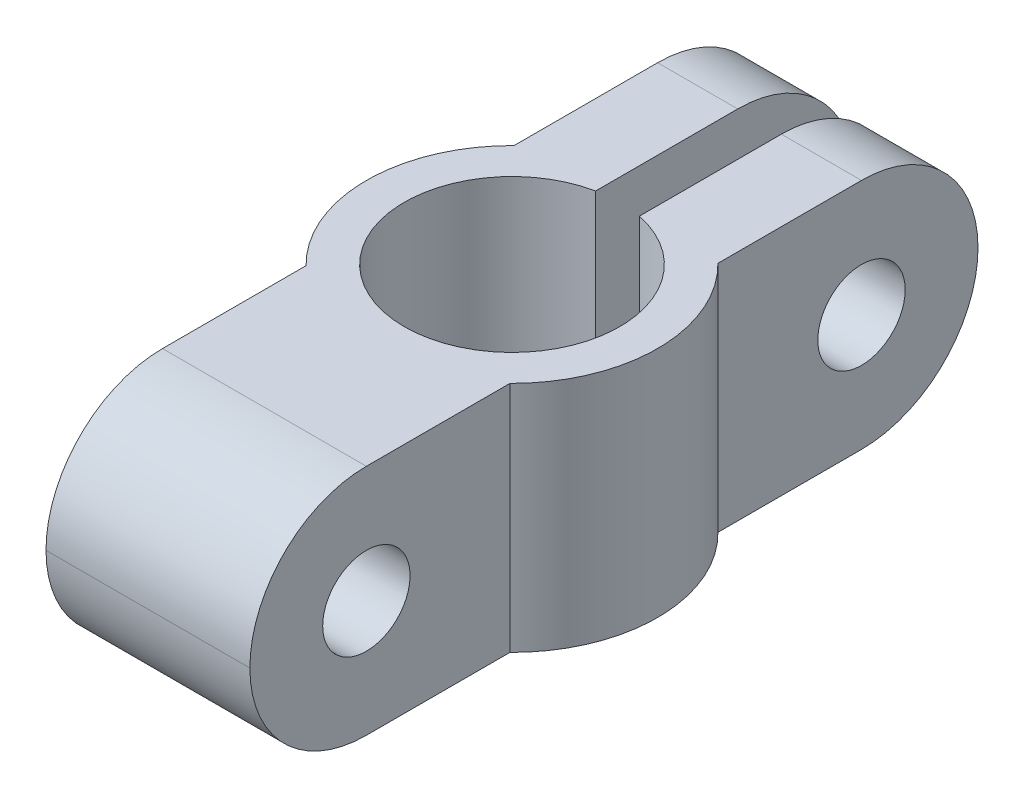
ISO-10303-21;
HEADER;
FILE_DESCRIPTION(('STEP AP214'),'2;1');
FILE_NAME('part.step','',(''),(''),'','','');
FILE_SCHEMA(('AUTOMOTIVE_DESIGN { 1 0 10303 214 1 1 1 1 }'));
ENDSEC;
DATA;
#1=APPLICATION_CONTEXT('core data for automotive mechanical design processes');
#2=APPLICATION_PROTOCOL_DEFINITION('international standard','automotive_design',2000,#1);
#3=PRODUCT_CONTEXT('',#1,'mechanical');
#4=PRODUCT('Part','Part','',(#3));
#5=PRODUCT_RELATED_PRODUCT_CATEGORY('part','',(#4));
#6=PRODUCT_DEFINITION_FORMATION('','',#4);
#7=PRODUCT_DEFINITION_CONTEXT('part definition',#1,'design');
#8=PRODUCT_DEFINITION('design','',#6,#7);
#9=PRODUCT_DEFINITION_SHAPE('','',#8);
#10=(LENGTH_UNIT() NAMED_UNIT(*) SI_UNIT(.MILLI.,.METRE.));
#11=(NAMED_UNIT(*) PLANE_ANGLE_UNIT() SI_UNIT($,.RADIAN.));
#12=(NAMED_UNIT(*) SI_UNIT($,.STERADIAN.) SOLID_ANGLE_UNIT());
#13=UNCERTAINTY_MEASURE_WITH_UNIT(LENGTH_MEASURE(1.E-05),#10,'distance_accuracy_value','');
#14=(GEOMETRIC_REPRESENTATION_CONTEXT(3) GLOBAL_UNCERTAINTY_ASSIGNED_CONTEXT((#13)) GLOBAL_UNIT_ASSIGNED_CONTEXT((#10,
#11,#12)) REPRESENTATION_CONTEXT('',''));
#15=CARTESIAN_POINT('',(0.,0.,0.));
#16=DIRECTION('',(0.,0.,1.));
#17=DIRECTION('',(1.,0.,0.));
#18=AXIS2_PLACEMENT_3D('',#15,#16,#17);
#19=CARTESIAN_POINT('',(0.,4.,-8.5));
#20=DIRECTION('',(1.,0.,0.));
#21=DIRECTION('',(0.,0.,-1.));
#22=AXIS2_PLACEMENT_3D('',#19,#20,#21);
#23=CYLINDRICAL_SURFACE('',#22,4.);
#24=CARTESIAN_POINT('',(0.75,4.,-8.5));
#25=DIRECTION('',(1.,0.,0.));
#26=DIRECTION('',(0.,0.,-1.));
#27=AXIS2_PLACEMENT_3D('',#24,#25,#26);
#28=CIRCLE('',#27,4.);
#29=CARTESIAN_POINT('',(0.75,8.,-8.5));
#30=VERTEX_POINT('',#29);
#31=CARTESIAN_POINT('',(0.75,4.,-12.5));
#32=VERTEX_POINT('',#31);
#33=EDGE_CURVE('E221',#30,#32,#28,.F.);
#34=ORIENTED_EDGE('',*,*,#33,.F.);
#35=DIRECTION('',(-1.,0.,0.));
#36=VECTOR('',#35,1.);
#37=CARTESIAN_POINT('',(-3.5,8.,-8.5));
#38=LINE('',#37,#36);
#39=CARTESIAN_POINT('',(3.5,8.,-8.5));
#40=VERTEX_POINT('',#39);
#41=EDGE_CURVE('E163',#40,#30,#38,.T.);
#42=ORIENTED_EDGE('',*,*,#41,.F.);
#43=CARTESIAN_POINT('',(3.5,4.,-8.5));
#44=DIRECTION('',(-1.,0.,0.));
#45=DIRECTION('',(0.,0.,1.));
#46=AXIS2_PLACEMENT_3D('',#43,#44,#45);
#47=CIRCLE('',#46,4.);
#48=CARTESIAN_POINT('',(3.5,4.,-12.5));
#49=VERTEX_POINT('',#48);
#50=EDGE_CURVE('E169',#49,#40,#47,.F.);
#51=ORIENTED_EDGE('',*,*,#50,.F.);
#52=DIRECTION('',(-1.,0.,0.));
#53=VECTOR('',#52,1.);
#54=CARTESIAN_POINT('',(3.5,4.,-12.5));
#55=LINE('',#54,#53);
#56=EDGE_CURVE('E176',#32,#49,#55,.F.);
#57=ORIENTED_EDGE('',*,*,#56,.F.);
#58=EDGE_LOOP('',(#34,#42,#51,#57));
#59=FACE_BOUND('',#58,.T.);
#60=ADVANCED_FACE('F35',(#59),#23,.T.);
#61=CARTESIAN_POINT('',(-3.5,4.,-8.5));
#62=DIRECTION('',(-1.,0.,0.));
#63=DIRECTION('',(0.,0.,1.));
#64=AXIS2_PLACEMENT_3D('',#61,#62,#63);
#65=CYLINDRICAL_SURFACE('',#64,4.);
#66=CARTESIAN_POINT('',(0.75,4.,-8.5));
#67=DIRECTION('',(1.,0.,0.));
#68=DIRECTION('',(0.,0.,-1.));
#69=AXIS2_PLACEMENT_3D('',#66,#67,#68);
#70=CIRCLE('',#69,4.);
#71=CARTESIAN_POINT('',(0.75,0.,-8.5));
#72=VERTEX_POINT('',#71);
#73=EDGE_CURVE('E219',#32,#72,#70,.F.);
#74=ORIENTED_EDGE('',*,*,#73,.F.);
#75=ORIENTED_EDGE('',*,*,#56,.T.);
#76=CARTESIAN_POINT('',(3.5,4.,-8.5));
#77=DIRECTION('',(-1.,0.,0.));
#78=DIRECTION('',(0.,0.,1.));
#79=AXIS2_PLACEMENT_3D('',#76,#77,#78);
#80=CIRCLE('',#79,4.);
#81=CARTESIAN_POINT('',(3.5,0.,-8.5));
#82=VERTEX_POINT('',#81);
#83=EDGE_CURVE('E164',#82,#49,#80,.F.);
#84=ORIENTED_EDGE('',*,*,#83,.F.);
#85=DIRECTION('',(-1.,0.,0.));
#86=VECTOR('',#85,1.);
#87=CARTESIAN_POINT('',(0.,0.,-8.5));
#88=LINE('',#87,#86);
#89=EDGE_CURVE('E276',#72,#82,#88,.F.);
#90=ORIENTED_EDGE('',*,*,#89,.F.);
#91=EDGE_LOOP('',(#74,#75,#84,#90));
#92=FACE_BOUND('',#91,.T.);
#93=ADVANCED_FACE('F293',(#92),#65,.T.);
#94=CARTESIAN_POINT('',(-5.,4.,-8.5));
#95=DIRECTION('',(1.,0.,0.));
#96=DIRECTION('',(0.,0.,-1.));
#97=AXIS2_PLACEMENT_3D('',#94,#95,#96);
#98=CYLINDRICAL_SURFACE('',#97,1.5);
#99=CARTESIAN_POINT('',(0.75,4.,-8.5));
#100=DIRECTION('',(1.,0.,0.));
#101=DIRECTION('',(0.,0.,-1.));
#102=AXIS2_PLACEMENT_3D('',#99,#100,#101);
#103=CIRCLE('',#102,1.5);
#104=CARTESIAN_POINT('',(0.75,4.,-9.99999999999999));
#105=VERTEX_POINT('',#104);
#106=EDGE_CURVE('E223',#105,#105,#103,.F.);
#107=ORIENTED_EDGE('',*,*,#106,.T.);
#108=EDGE_LOOP('',(#107));
#109=FACE_BOUND('',#108,.T.);
#110=CARTESIAN_POINT('',(3.5,4.,-8.5));
#111=DIRECTION('',(1.,0.,0.));
#112=DIRECTION('',(0.,0.,-1.));
#113=AXIS2_PLACEMENT_3D('',#110,#111,#112);
#114=CIRCLE('',#113,1.5);
#115=CARTESIAN_POINT('',(3.5,4.,-10.));
#116=VERTEX_POINT('',#115);
#117=EDGE_CURVE('E180',#116,#116,#114,.T.);
#118=ORIENTED_EDGE('',*,*,#117,.T.);
#119=EDGE_LOOP('',(#118));
#120=FACE_BOUND('',#119,.T.);
#121=ADVANCED_FACE('F331',(#109,#120),#98,.F.);
#122=CARTESIAN_POINT('',(0.,8.,0.));
#123=DIRECTION('',(0.,-1.,0.));
#124=DIRECTION('',(0.,0.,-1.));
#125=AXIS2_PLACEMENT_3D('',#122,#123,#124);
#126=CYLINDRICAL_SURFACE('',#125,5.);
#127=CARTESIAN_POINT('',(0.,0.,0.));
#128=DIRECTION('',(0.,1.,0.));
#129=DIRECTION('',(0.,0.,1.));
#130=AXIS2_PLACEMENT_3D('',#127,#128,#129);
#131=CIRCLE('',#130,5.);
#132=CARTESIAN_POINT('',(-3.5,0.,-3.57071421427143));
#133=VERTEX_POINT('',#132);
#134=CARTESIAN_POINT('',(-3.5,0.,3.57071421427143));
#135=VERTEX_POINT('',#134);
#136=EDGE_CURVE('E175',#133,#135,#131,.T.);
#137=ORIENTED_EDGE('',*,*,#136,.T.);
#138=DIRECTION('',(0.,-1.,0.));
#139=VECTOR('',#138,1.);
#140=CARTESIAN_POINT('',(-3.5,8.,3.57071421427143));
#141=LINE('',#140,#139);
#142=CARTESIAN_POINT('',(-3.5,8.,3.57071421427143));
#143=VERTEX_POINT('',#142);
#144=EDGE_CURVE('E270',#143,#135,#141,.T.);
#145=ORIENTED_EDGE('',*,*,#144,.F.);
#146=CARTESIAN_POINT('',(0.,8.,0.));
#147=DIRECTION('',(0.,1.,0.));
#148=DIRECTION('',(0.,0.,1.));
#149=AXIS2_PLACEMENT_3D('',#146,#147,#148);
#150=CIRCLE('',#149,5.);
#151=CARTESIAN_POINT('',(-3.5,8.,-3.57071421427143));
#152=VERTEX_POINT('',#151);
#153=EDGE_CURVE('E232',#152,#143,#150,.T.);
#154=ORIENTED_EDGE('',*,*,#153,.F.);
#155=DIRECTION('',(0.,-1.,0.));
#156=VECTOR('',#155,1.);
#157=CARTESIAN_POINT('',(-3.5,8.,-3.57071421427143));
#158=LINE('',#157,#156);
#159=EDGE_CURVE('E248',#152,#133,#158,.T.);
#160=ORIENTED_EDGE('',*,*,#159,.T.);
#161=EDGE_LOOP('',(#137,#145,#154,#160));
#162=FACE_BOUND('',#161,.T.);
#163=ADVANCED_FACE('F314',(#162),#126,.T.);
#164=CARTESIAN_POINT('',(-3.5,8.,12.5));
#165=DIRECTION('',(1.,0.,0.));
#166=DIRECTION('',(0.,0.,-1.));
#167=AXIS2_PLACEMENT_3D('',#164,#165,#166);
#168=PLANE('',#167);
#169=CARTESIAN_POINT('',(-3.5,4.,8.5));
#170=DIRECTION('',(-1.,0.,0.));
#171=DIRECTION('',(0.,0.,1.));
#172=AXIS2_PLACEMENT_3D('',#169,#170,#171);
#173=CIRCLE('',#172,1.5);
#174=CARTESIAN_POINT('',(-3.5,4.,10.));
#175=VERTEX_POINT('',#174);
#176=EDGE_CURVE('E198',#175,#175,#173,.T.);
#177=ORIENTED_EDGE('',*,*,#176,.F.);
#178=EDGE_LOOP('',(#177));
#179=FACE_BOUND('',#178,.T.);
#180=CARTESIAN_POINT('',(-3.5,4.,8.5));
#181=DIRECTION('',(1.,0.,0.));
#182=DIRECTION('',(0.,0.,-1.));
#183=AXIS2_PLACEMENT_3D('',#180,#181,#182);
#184=CIRCLE('',#183,4.);
#185=CARTESIAN_POINT('',(-3.5,0.,8.5));
#186=VERTEX_POINT('',#185);
#187=CARTESIAN_POINT('',(-3.5,4.,12.5));
#188=VERTEX_POINT('',#187);
#189=EDGE_CURVE('E187',#186,#188,#184,.F.);
#190=ORIENTED_EDGE('',*,*,#189,.T.);
#191=CARTESIAN_POINT('',(-3.5,4.,8.5));
#192=DIRECTION('',(1.,0.,0.));
#193=DIRECTION('',(0.,0.,-1.));
#194=AXIS2_PLACEMENT_3D('',#191,#192,#193);
#195=CIRCLE('',#194,4.);
#196=CARTESIAN_POINT('',(-3.5,8.,8.5));
#197=VERTEX_POINT('',#196);
#198=EDGE_CURVE('E189',#188,#197,#195,.F.);
#199=ORIENTED_EDGE('',*,*,#198,.T.);
#200=DIRECTION('',(0.,0.,1.));
#201=VECTOR('',#200,1.);
#202=CARTESIAN_POINT('',(-3.5,8.,12.5));
#203=LINE('',#202,#201);
#204=EDGE_CURVE('E235',#143,#197,#203,.T.);
#205=ORIENTED_EDGE('',*,*,#204,.F.);
#206=ORIENTED_EDGE('',*,*,#144,.T.);
#207=DIRECTION('',(0.,0.,1.));
#208=VECTOR('',#207,1.);
#209=CARTESIAN_POINT('',(-3.5,0.,12.5));
#210=LINE('',#209,#208);
#211=EDGE_CURVE('E251',#135,#186,#210,.T.);
#212=ORIENTED_EDGE('',*,*,#211,.T.);
#213=EDGE_LOOP('',(#190,#199,#205,#206,#212));
#214=FACE_BOUND('',#213,.T.);
#215=ADVANCED_FACE('F310',(#179,#214),#168,.F.);
#216=CARTESIAN_POINT('',(3.5,8.,12.5));
#217=DIRECTION('',(-1.,0.,0.));
#218=DIRECTION('',(0.,0.,1.));
#219=AXIS2_PLACEMENT_3D('',#216,#217,#218);
#220=PLANE('',#219);
#221=CARTESIAN_POINT('',(3.5,4.,8.5));
#222=DIRECTION('',(-1.,0.,0.));
#223=DIRECTION('',(0.,0.,1.));
#224=AXIS2_PLACEMENT_3D('',#221,#222,#223);
#225=CIRCLE('',#224,1.5);
#226=CARTESIAN_POINT('',(3.5,4.,10.));
#227=VERTEX_POINT('',#226);
#228=EDGE_CURVE('E196',#227,#227,#225,.T.);
#229=ORIENTED_EDGE('',*,*,#228,.T.);
#230=EDGE_LOOP('',(#229));
#231=FACE_BOUND('',#230,.T.);
#232=DIRECTION('',(0.,0.,-1.));
#233=VECTOR('',#232,1.);
#234=CARTESIAN_POINT('',(3.5,8.,12.5));
#235=LINE('',#234,#233);
#236=CARTESIAN_POINT('',(3.5,8.,8.5));
#237=VERTEX_POINT('',#236);
#238=CARTESIAN_POINT('',(3.5,8.,3.57071421427142));
#239=VERTEX_POINT('',#238);
#240=EDGE_CURVE('E239',#237,#239,#235,.T.);
#241=ORIENTED_EDGE('',*,*,#240,.F.);
#242=CARTESIAN_POINT('',(3.5,4.,8.5));
#243=DIRECTION('',(-1.,0.,0.));
#244=DIRECTION('',(0.,0.,1.));
#245=AXIS2_PLACEMENT_3D('',#242,#243,#244);
#246=CIRCLE('',#245,4.);
#247=CARTESIAN_POINT('',(3.5,4.,12.5));
#248=VERTEX_POINT('',#247);
#249=EDGE_CURVE('E185',#237,#248,#246,.F.);
#250=ORIENTED_EDGE('',*,*,#249,.T.);
#251=CARTESIAN_POINT('',(3.5,4.,8.5));
#252=DIRECTION('',(-1.,0.,0.));
#253=DIRECTION('',(0.,0.,1.));
#254=AXIS2_PLACEMENT_3D('',#251,#252,#253);
#255=CIRCLE('',#254,4.);
#256=CARTESIAN_POINT('',(3.5,0.,8.5));
#257=VERTEX_POINT('',#256);
#258=EDGE_CURVE('E183',#248,#257,#255,.F.);
#259=ORIENTED_EDGE('',*,*,#258,.T.);
#260=DIRECTION('',(0.,0.,-1.));
#261=VECTOR('',#260,1.);
#262=CARTESIAN_POINT('',(3.5,0.,12.5));
#263=LINE('',#262,#261);
#264=CARTESIAN_POINT('',(3.5,0.,3.57071421427142));
#265=VERTEX_POINT('',#264);
#266=EDGE_CURVE('E254',#257,#265,#263,.T.);
#267=ORIENTED_EDGE('',*,*,#266,.T.);
#268=DIRECTION('',(0.,-1.,0.));
#269=VECTOR('',#268,1.);
#270=CARTESIAN_POINT('',(3.5,8.,3.57071421427142));
#271=LINE('',#270,#269);
#272=EDGE_CURVE('E267',#239,#265,#271,.T.);
#273=ORIENTED_EDGE('',*,*,#272,.F.);
#274=EDGE_LOOP('',(#241,#250,#259,#267,#273));
#275=FACE_BOUND('',#274,.T.);
#276=ADVANCED_FACE('F302',(#231,#275),#220,.F.);
#277=CARTESIAN_POINT('',(0.,8.,0.));
#278=DIRECTION('',(0.,-1.,0.));
#279=DIRECTION('',(0.,0.,-1.));
#280=AXIS2_PLACEMENT_3D('',#277,#278,#279);
#281=CYLINDRICAL_SURFACE('',#280,5.);
#282=CARTESIAN_POINT('',(0.,0.,0.));
#283=DIRECTION('',(0.,1.,0.));
#284=DIRECTION('',(0.,0.,1.));
#285=AXIS2_PLACEMENT_3D('',#282,#283,#284);
#286=CIRCLE('',#285,5.);
#287=CARTESIAN_POINT('',(3.5,0.,-3.57071421427142));
#288=VERTEX_POINT('',#287);
#289=EDGE_CURVE('E256',#265,#288,#286,.T.);
#290=ORIENTED_EDGE('',*,*,#289,.T.);
#291=DIRECTION('',(0.,-1.,0.));
#292=VECTOR('',#291,1.);
#293=CARTESIAN_POINT('',(3.5,8.,-3.57071421427142));
#294=LINE('',#293,#292);
#295=CARTESIAN_POINT('',(3.5,8.,-3.57071421427142));
#296=VERTEX_POINT('',#295);
#297=EDGE_CURVE('E264',#296,#288,#294,.T.);
#298=ORIENTED_EDGE('',*,*,#297,.F.);
#299=CARTESIAN_POINT('',(0.,8.,0.));
#300=DIRECTION('',(0.,1.,0.));
#301=DIRECTION('',(0.,0.,1.));
#302=AXIS2_PLACEMENT_3D('',#299,#300,#301);
#303=CIRCLE('',#302,5.);
#304=EDGE_CURVE('E241',#239,#296,#303,.T.);
#305=ORIENTED_EDGE('',*,*,#304,.F.);
#306=ORIENTED_EDGE('',*,*,#272,.T.);
#307=EDGE_LOOP('',(#290,#298,#305,#306));
#308=FACE_BOUND('',#307,.T.);
#309=ADVANCED_FACE('F298',(#308),#281,.T.);
#310=CARTESIAN_POINT('',(3.5,8.,-3.57071421427142));
#311=DIRECTION('',(-1.,0.,0.));
#312=DIRECTION('',(0.,0.,1.));
#313=AXIS2_PLACEMENT_3D('',#310,#311,#312);
#314=PLANE('',#313);
#315=ORIENTED_EDGE('',*,*,#117,.F.);
#316=EDGE_LOOP('',(#315));
#317=FACE_BOUND('',#316,.T.);
#318=DIRECTION('',(0.,0.,-1.));
#319=VECTOR('',#318,1.);
#320=CARTESIAN_POINT('',(3.5,0.,-3.57071421427142));
#321=LINE('',#320,#319);
#322=EDGE_CURVE('E258',#288,#82,#321,.T.);
#323=ORIENTED_EDGE('',*,*,#322,.T.);
#324=ORIENTED_EDGE('',*,*,#83,.T.);
#325=ORIENTED_EDGE('',*,*,#50,.T.);
#326=DIRECTION('',(0.,0.,-1.));
#327=VECTOR('',#326,1.);
#328=CARTESIAN_POINT('',(3.5,8.,-3.57071421427142));
#329=LINE('',#328,#327);
#330=EDGE_CURVE('E243',#296,#40,#329,.T.);
#331=ORIENTED_EDGE('',*,*,#330,.F.);
#332=ORIENTED_EDGE('',*,*,#297,.T.);
#333=EDGE_LOOP('',(#323,#324,#325,#331,#332));
#334=FACE_BOUND('',#333,.T.);
#335=ADVANCED_FACE('F280',(#317,#334),#314,.F.);
#336=CARTESIAN_POINT('',(-3.5,8.,-3.57071421427143));
#337=DIRECTION('',(1.,0.,0.));
#338=DIRECTION('',(0.,0.,-1.));
#339=AXIS2_PLACEMENT_3D('',#336,#337,#338);
#340=PLANE('',#339);
#341=CARTESIAN_POINT('',(-3.5,4.,-8.5));
#342=DIRECTION('',(1.,0.,0.));
#343=DIRECTION('',(0.,0.,-1.));
#344=AXIS2_PLACEMENT_3D('',#341,#342,#343);
#345=CIRCLE('',#344,1.5);
#346=CARTESIAN_POINT('',(-3.5,4.,-9.99999999999999));
#347=VERTEX_POINT('',#346);
#348=EDGE_CURVE('E177',#347,#347,#345,.T.);
#349=ORIENTED_EDGE('',*,*,#348,.T.);
#350=EDGE_LOOP('',(#349));
#351=FACE_BOUND('',#350,.T.);
#352=CARTESIAN_POINT('',(-3.5,4.,-8.5));
#353=DIRECTION('',(1.,0.,0.));
#354=DIRECTION('',(0.,0.,-1.));
#355=AXIS2_PLACEMENT_3D('',#352,#353,#354);
#356=CIRCLE('',#355,4.);
#357=CARTESIAN_POINT('',(-3.5,8.,-8.5));
#358=VERTEX_POINT('',#357);
#359=CARTESIAN_POINT('',(-3.5,4.,-12.5));
#360=VERTEX_POINT('',#359);
#361=EDGE_CURVE('E162',#358,#360,#356,.F.);
#362=ORIENTED_EDGE('',*,*,#361,.T.);
#363=CARTESIAN_POINT('',(-3.5,4.,-8.5));
#364=DIRECTION('',(1.,0.,0.));
#365=DIRECTION('',(0.,0.,-1.));
#366=AXIS2_PLACEMENT_3D('',#363,#364,#365);
#367=CIRCLE('',#366,4.);
#368=CARTESIAN_POINT('',(-3.5,0.,-8.5));
#369=VERTEX_POINT('',#368);
#370=EDGE_CURVE('E274',#360,#369,#367,.F.);
#371=ORIENTED_EDGE('',*,*,#370,.T.);
#372=DIRECTION('',(0.,0.,1.));
#373=VECTOR('',#372,1.);
#374=CARTESIAN_POINT('',(-3.5,0.,-3.57071421427143));
#375=LINE('',#374,#373);
#376=EDGE_CURVE('E236',#369,#133,#375,.T.);
#377=ORIENTED_EDGE('',*,*,#376,.T.);
#378=ORIENTED_EDGE('',*,*,#159,.F.);
#379=DIRECTION('',(0.,0.,1.));
#380=VECTOR('',#379,1.);
#381=CARTESIAN_POINT('',(-3.5,8.,-3.57071421427143));
#382=LINE('',#381,#380);
#383=EDGE_CURVE('E246',#358,#152,#382,.T.);
#384=ORIENTED_EDGE('',*,*,#383,.F.);
#385=EDGE_LOOP('',(#362,#371,#377,#378,#384));
#386=FACE_BOUND('',#385,.T.);
#387=ADVANCED_FACE('F318',(#351,#386),#340,.F.);
#388=CARTESIAN_POINT('',(0.,8.,0.));
#389=DIRECTION('',(0.,1.,0.));
#390=DIRECTION('',(0.,0.,1.));
#391=AXIS2_PLACEMENT_3D('',#388,#389,#390);
#392=PLANE('',#391);
#393=DIRECTION('',(0.,0.,-1.));
#394=VECTOR('',#393,1.);
#395=CARTESIAN_POINT('',(0.75,8.,-3.5));
#396=LINE('',#395,#394);
#397=CARTESIAN_POINT('',(0.75,8.,-3.62318920289846));
#398=VERTEX_POINT('',#397);
#399=EDGE_CURVE('E158',#398,#30,#396,.T.);
#400=ORIENTED_EDGE('',*,*,#399,.F.);
#401=CARTESIAN_POINT('',(0.,8.,0.));
#402=DIRECTION('',(0.,1.,0.));
#403=DIRECTION('',(0.,0.,1.));
#404=AXIS2_PLACEMENT_3D('',#401,#402,#403);
#405=CIRCLE('',#404,3.7);
#406=CARTESIAN_POINT('',(-0.75,8.,-3.62318920289846));
#407=VERTEX_POINT('',#406);
#408=EDGE_CURVE('E157',#407,#398,#405,.T.);
#409=ORIENTED_EDGE('',*,*,#408,.F.);
#410=DIRECTION('',(0.,0.,1.));
#411=VECTOR('',#410,1.);
#412=CARTESIAN_POINT('',(-0.75,8.,-14.6057269746104));
#413=LINE('',#412,#411);
#414=CARTESIAN_POINT('',(-0.75,8.,-8.5));
#415=VERTEX_POINT('',#414);
#416=EDGE_CURVE('E50',#415,#407,#413,.T.);
#417=ORIENTED_EDGE('',*,*,#416,.F.);
#418=EDGE_CURVE('E154',#415,#358,#38,.T.);
#419=ORIENTED_EDGE('',*,*,#418,.T.);
#420=ORIENTED_EDGE('',*,*,#383,.T.);
#421=ORIENTED_EDGE('',*,*,#153,.T.);
#422=ORIENTED_EDGE('',*,*,#204,.T.);
#423=DIRECTION('',(1.,0.,0.));
#424=VECTOR('',#423,1.);
#425=CARTESIAN_POINT('',(3.5,8.,8.5));
#426=LINE('',#425,#424);
#427=EDGE_CURVE('E167',#197,#237,#426,.T.);
#428=ORIENTED_EDGE('',*,*,#427,.T.);
#429=ORIENTED_EDGE('',*,*,#240,.T.);
#430=ORIENTED_EDGE('',*,*,#304,.T.);
#431=ORIENTED_EDGE('',*,*,#330,.T.);
#432=ORIENTED_EDGE('',*,*,#41,.T.);
#433=EDGE_LOOP('',(#400,#409,#417,#419,#420,#421,#422,#428,#429,#430,#431,#432));
#434=FACE_BOUND('',#433,.T.);
#435=ADVANCED_FACE('F153',(#434),#392,.T.);
#436=CARTESIAN_POINT('',(0.,0.,0.));
#437=DIRECTION('',(0.,1.,0.));
#438=DIRECTION('',(0.,0.,1.));
#439=AXIS2_PLACEMENT_3D('',#436,#437,#438);
#440=PLANE('',#439);
#441=CARTESIAN_POINT('',(0.,0.,0.));
#442=DIRECTION('',(0.,1.,0.));
#443=DIRECTION('',(0.,0.,1.));
#444=AXIS2_PLACEMENT_3D('',#441,#442,#443);
#445=CIRCLE('',#444,3.7);
#446=CARTESIAN_POINT('',(-0.75,0.,-3.62318920289846));
#447=VERTEX_POINT('',#446);
#448=CARTESIAN_POINT('',(0.75,0.,-3.62318920289846));
#449=VERTEX_POINT('',#448);
#450=EDGE_CURVE('E203',#447,#449,#445,.T.);
#451=ORIENTED_EDGE('',*,*,#450,.T.);
#452=DIRECTION('',(0.,0.,-1.));
#453=VECTOR('',#452,1.);
#454=CARTESIAN_POINT('',(0.75,0.,0.));
#455=LINE('',#454,#453);
#456=EDGE_CURVE('E58',#449,#72,#455,.T.);
#457=ORIENTED_EDGE('',*,*,#456,.T.);
#458=ORIENTED_EDGE('',*,*,#89,.T.);
#459=ORIENTED_EDGE('',*,*,#322,.F.);
#460=ORIENTED_EDGE('',*,*,#289,.F.);
#461=ORIENTED_EDGE('',*,*,#266,.F.);
#462=DIRECTION('',(1.,0.,0.));
#463=VECTOR('',#462,1.);
#464=CARTESIAN_POINT('',(0.,0.,8.5));
#465=LINE('',#464,#463);
#466=EDGE_CURVE('E191',#257,#186,#465,.F.);
#467=ORIENTED_EDGE('',*,*,#466,.T.);
#468=ORIENTED_EDGE('',*,*,#211,.F.);
#469=ORIENTED_EDGE('',*,*,#136,.F.);
#470=ORIENTED_EDGE('',*,*,#376,.F.);
#471=CARTESIAN_POINT('',(-0.75,0.,-8.5));
#472=VERTEX_POINT('',#471);
#473=EDGE_CURVE('E211',#369,#472,#88,.F.);
#474=ORIENTED_EDGE('',*,*,#473,.T.);
#475=DIRECTION('',(0.,0.,1.));
#476=VECTOR('',#475,1.);
#477=CARTESIAN_POINT('',(-0.75,0.,0.));
#478=LINE('',#477,#476);
#479=EDGE_CURVE('E205',#472,#447,#478,.T.);
#480=ORIENTED_EDGE('',*,*,#479,.T.);
#481=EDGE_LOOP('',(#451,#457,#458,#459,#460,#461,#467,#468,#469,#470,#474,#480));
#482=FACE_BOUND('',#481,.T.);
#483=ADVANCED_FACE('F208',(#482),#440,.F.);
#484=CARTESIAN_POINT('',(-0.75,4.,-8.5));
#485=DIRECTION('',(-1.,0.,0.));
#486=DIRECTION('',(0.,0.,1.));
#487=AXIS2_PLACEMENT_3D('',#484,#485,#486);
#488=CIRCLE('',#487,4.);
#489=CARTESIAN_POINT('',(-0.75,4.,-12.5));
#490=VERTEX_POINT('',#489);
#491=EDGE_CURVE('E139',#490,#415,#488,.F.);
#492=ORIENTED_EDGE('',*,*,#491,.F.);
#493=EDGE_CURVE('E173',#360,#490,#55,.F.);
#494=ORIENTED_EDGE('',*,*,#493,.F.);
#495=ORIENTED_EDGE('',*,*,#361,.F.);
#496=ORIENTED_EDGE('',*,*,#418,.F.);
#497=EDGE_LOOP('',(#492,#494,#495,#496));
#498=FACE_BOUND('',#497,.T.);
#499=ADVANCED_FACE('F161',(#498),#23,.T.);
#500=CARTESIAN_POINT('',(-0.75,4.,-8.5));
#501=DIRECTION('',(-1.,0.,0.));
#502=DIRECTION('',(0.,0.,1.));
#503=AXIS2_PLACEMENT_3D('',#500,#501,#502);
#504=CIRCLE('',#503,4.);
#505=EDGE_CURVE('E143',#472,#490,#504,.F.);
#506=ORIENTED_EDGE('',*,*,#505,.F.);
#507=ORIENTED_EDGE('',*,*,#473,.F.);
#508=ORIENTED_EDGE('',*,*,#370,.F.);
#509=ORIENTED_EDGE('',*,*,#493,.T.);
#510=EDGE_LOOP('',(#506,#507,#508,#509));
#511=FACE_BOUND('',#510,.T.);
#512=ADVANCED_FACE('F321',(#511),#65,.T.);
#513=CARTESIAN_POINT('',(-0.75,4.,-8.5));
#514=DIRECTION('',(-1.,0.,0.));
#515=DIRECTION('',(0.,0.,1.));
#516=AXIS2_PLACEMENT_3D('',#513,#514,#515);
#517=CIRCLE('',#516,1.5);
#518=CARTESIAN_POINT('',(-0.75,4.,-7.));
#519=VERTEX_POINT('',#518);
#520=EDGE_CURVE('E148',#519,#519,#517,.F.);
#521=ORIENTED_EDGE('',*,*,#520,.T.);
#522=EDGE_LOOP('',(#521));
#523=FACE_BOUND('',#522,.T.);
#524=ORIENTED_EDGE('',*,*,#348,.F.);
#525=EDGE_LOOP('',(#524));
#526=FACE_BOUND('',#525,.T.);
#527=ADVANCED_FACE('F323',(#523,#526),#98,.F.);
#528=CARTESIAN_POINT('',(0.,0.,0.));
#529=DIRECTION('',(0.,1.,0.));
#530=DIRECTION('',(0.,0.,1.));
#531=AXIS2_PLACEMENT_3D('',#528,#529,#530);
#532=CYLINDRICAL_SURFACE('',#531,3.7);
#533=ORIENTED_EDGE('',*,*,#408,.T.);
#534=DIRECTION('',(0.,1.,0.));
#535=VECTOR('',#534,1.);
#536=CARTESIAN_POINT('',(0.75,0.,-3.62318920289846));
#537=LINE('',#536,#535);
#538=EDGE_CURVE('E11',#398,#449,#537,.F.);
#539=ORIENTED_EDGE('',*,*,#538,.T.);
#540=ORIENTED_EDGE('',*,*,#450,.F.);
#541=DIRECTION('',(0.,1.,0.));
#542=VECTOR('',#541,1.);
#543=CARTESIAN_POINT('',(-0.75,0.,-3.62318920289846));
#544=LINE('',#543,#542);
#545=EDGE_CURVE('E43',#447,#407,#544,.T.);
#546=ORIENTED_EDGE('',*,*,#545,.T.);
#547=EDGE_LOOP('',(#533,#539,#540,#546));
#548=FACE_BOUND('',#547,.T.);
#549=ADVANCED_FACE('F201',(#548),#532,.F.);
#550=CARTESIAN_POINT('',(-3.5,4.,8.5));
#551=DIRECTION('',(1.,0.,0.));
#552=DIRECTION('',(0.,0.,-1.));
#553=AXIS2_PLACEMENT_3D('',#550,#551,#552);
#554=CYLINDRICAL_SURFACE('',#553,4.);
#555=DIRECTION('',(1.,0.,0.));
#556=VECTOR('',#555,1.);
#557=CARTESIAN_POINT('',(-3.5,4.,12.5));
#558=LINE('',#557,#556);
#559=EDGE_CURVE('E193',#188,#248,#558,.T.);
#560=ORIENTED_EDGE('',*,*,#559,.F.);
#561=ORIENTED_EDGE('',*,*,#189,.F.);
#562=ORIENTED_EDGE('',*,*,#466,.F.);
#563=ORIENTED_EDGE('',*,*,#258,.F.);
#564=EDGE_LOOP('',(#560,#561,#562,#563));
#565=FACE_BOUND('',#564,.T.);
#566=ADVANCED_FACE('F37',(#565),#554,.T.);
#567=CARTESIAN_POINT('',(0.,4.,8.5));
#568=DIRECTION('',(-1.,0.,0.));
#569=DIRECTION('',(0.,0.,1.));
#570=AXIS2_PLACEMENT_3D('',#567,#568,#569);
#571=CYLINDRICAL_SURFACE('',#570,4.);
#572=ORIENTED_EDGE('',*,*,#198,.F.);
#573=ORIENTED_EDGE('',*,*,#559,.T.);
#574=ORIENTED_EDGE('',*,*,#249,.F.);
#575=ORIENTED_EDGE('',*,*,#427,.F.);
#576=EDGE_LOOP('',(#572,#573,#574,#575));
#577=FACE_BOUND('',#576,.T.);
#578=ADVANCED_FACE('F338',(#577),#571,.T.);
#579=CARTESIAN_POINT('',(5.,4.,8.5));
#580=DIRECTION('',(-1.,0.,0.));
#581=DIRECTION('',(0.,0.,1.));
#582=AXIS2_PLACEMENT_3D('',#579,#580,#581);
#583=CYLINDRICAL_SURFACE('',#582,1.5);
#584=ORIENTED_EDGE('',*,*,#176,.T.);
#585=EDGE_LOOP('',(#584));
#586=FACE_BOUND('',#585,.T.);
#587=ORIENTED_EDGE('',*,*,#228,.F.);
#588=EDGE_LOOP('',(#587));
#589=FACE_BOUND('',#588,.T.);
#590=ADVANCED_FACE('F340',(#586,#589),#583,.F.);
#591=CARTESIAN_POINT('',(-0.75,-2.,-14.6057269746104));
#592=DIRECTION('',(-1.,0.,0.));
#593=DIRECTION('',(0.,0.,1.));
#594=AXIS2_PLACEMENT_3D('',#591,#592,#593);
#595=PLANE('',#594);
#596=ORIENTED_EDGE('',*,*,#491,.T.);
#597=ORIENTED_EDGE('',*,*,#416,.T.);
#598=ORIENTED_EDGE('',*,*,#545,.F.);
#599=ORIENTED_EDGE('',*,*,#479,.F.);
#600=ORIENTED_EDGE('',*,*,#505,.T.);
#601=EDGE_LOOP('',(#596,#597,#598,#599,#600));
#602=FACE_BOUND('',#601,.T.);
#603=ORIENTED_EDGE('',*,*,#520,.F.);
#604=EDGE_LOOP('',(#603));
#605=FACE_BOUND('',#604,.T.);
#606=ADVANCED_FACE('F140',(#602,#605),#595,.F.);
#607=CARTESIAN_POINT('',(0.75,-2.,-3.5));
#608=DIRECTION('',(1.,0.,0.));
#609=DIRECTION('',(0.,0.,-1.));
#610=AXIS2_PLACEMENT_3D('',#607,#608,#609);
#611=PLANE('',#610);
#612=ORIENTED_EDGE('',*,*,#33,.T.);
#613=ORIENTED_EDGE('',*,*,#73,.T.);
#614=ORIENTED_EDGE('',*,*,#456,.F.);
#615=ORIENTED_EDGE('',*,*,#538,.F.);
#616=ORIENTED_EDGE('',*,*,#399,.T.);
#617=EDGE_LOOP('',(#612,#613,#614,#615,#616));
#618=FACE_BOUND('',#617,.T.);
#619=ORIENTED_EDGE('',*,*,#106,.F.);
#620=EDGE_LOOP('',(#619));
#621=FACE_BOUND('',#620,.T.);
#622=ADVANCED_FACE('F289',(#618,#621),#611,.F.);
#623=CLOSED_SHELL('',(#60,#93,#121,#163,#215,#276,#309,#335,#387,#435,#483,#499,#512,#527,#549,
#566,#578,#590,#606,#622));
#624=MANIFOLD_SOLID_BREP('B2',#623);
#625=ADVANCED_BREP_SHAPE_REPRESENTATION('',(#18,#624),#14);
#626=SHAPE_DEFINITION_REPRESENTATION(#9,#625);
ENDSEC;
END-ISO-10303-21;
